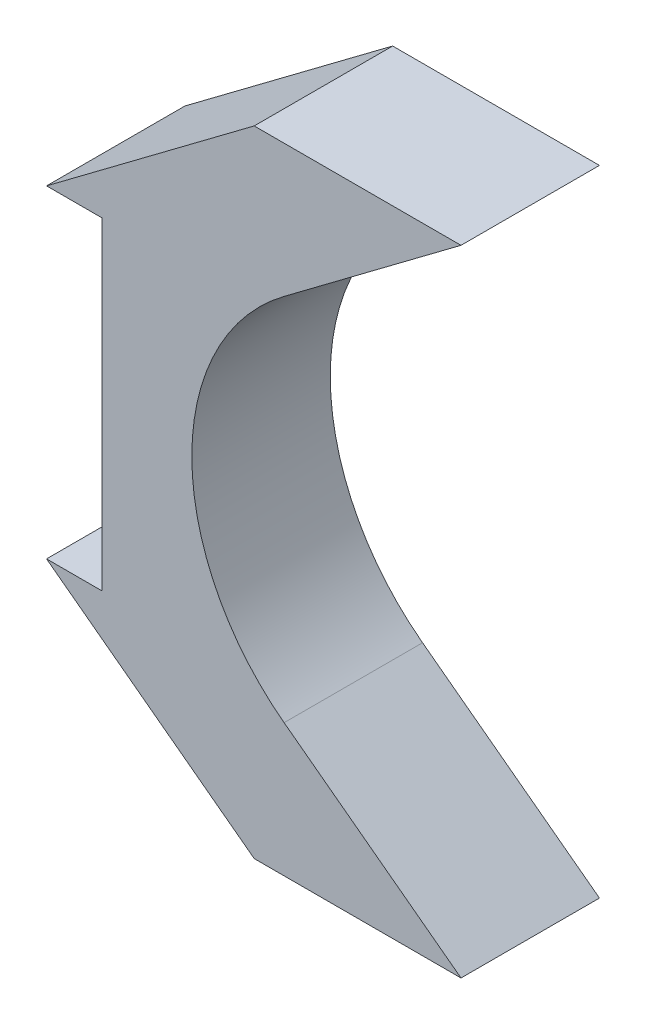
ISO-10303-21;
HEADER;
FILE_DESCRIPTION(('STEP AP214'),'2;1');
FILE_NAME('part.step','',(''),(''),'','','');
FILE_SCHEMA(('AUTOMOTIVE_DESIGN { 1 0 10303 214 1 1 1 1 }'));
ENDSEC;
DATA;
#1=APPLICATION_CONTEXT('core data for automotive mechanical design processes');
#2=APPLICATION_PROTOCOL_DEFINITION('international standard','automotive_design',2000,#1);
#3=PRODUCT_CONTEXT('',#1,'mechanical');
#4=PRODUCT('Part','Part','',(#3));
#5=PRODUCT_RELATED_PRODUCT_CATEGORY('part','',(#4));
#6=PRODUCT_DEFINITION_FORMATION('','',#4);
#7=PRODUCT_DEFINITION_CONTEXT('part definition',#1,'design');
#8=PRODUCT_DEFINITION('design','',#6,#7);
#9=PRODUCT_DEFINITION_SHAPE('','',#8);
#10=(LENGTH_UNIT() NAMED_UNIT(*) SI_UNIT(.MILLI.,.METRE.));
#11=(NAMED_UNIT(*) PLANE_ANGLE_UNIT() SI_UNIT($,.RADIAN.));
#12=(NAMED_UNIT(*) SI_UNIT($,.STERADIAN.) SOLID_ANGLE_UNIT());
#13=UNCERTAINTY_MEASURE_WITH_UNIT(LENGTH_MEASURE(1.E-05),#10,'distance_accuracy_value','');
#14=(GEOMETRIC_REPRESENTATION_CONTEXT(3) GLOBAL_UNCERTAINTY_ASSIGNED_CONTEXT((#13)) GLOBAL_UNIT_ASSIGNED_CONTEXT((#10,
#11,#12)) REPRESENTATION_CONTEXT('',''));
#15=CARTESIAN_POINT('',(0.,0.,0.));
#16=DIRECTION('',(0.,0.,1.));
#17=DIRECTION('',(1.,0.,0.));
#18=AXIS2_PLACEMENT_3D('',#15,#16,#17);
#19=CARTESIAN_POINT('',(16.0000000000196,85.,36.5));
#20=DIRECTION('',(-1.,0.,0.));
#21=DIRECTION('',(0.,-1.,0.));
#22=AXIS2_PLACEMENT_3D('',#19,#20,#21);
#23=CONICAL_SURFACE('',#22,1.24999999999093,1.02974425741328);
#24=CARTESIAN_POINT('',(16.7510757758007,85.0000000000364,36.5));
#25=VERTEX_POINT('',#24);
#26=VERTEX_LOOP('',#25);
#27=FACE_BOUND('',#26,.T.);
#28=CARTESIAN_POINT('',(15.9999999999997,85.,36.5));
#29=DIRECTION('',(1.,0.,0.));
#30=DIRECTION('',(0.,1.,0.));
#31=AXIS2_PLACEMENT_3D('',#28,#29,#30);
#32=CIRCLE('',#31,1.25);
#33=CARTESIAN_POINT('',(15.9999999999997,86.25,36.5));
#34=VERTEX_POINT('',#33);
#35=EDGE_CURVE('E232',#34,#34,#32,.F.);
#36=ORIENTED_EDGE('',*,*,#35,.T.);
#37=EDGE_LOOP('',(#36));
#38=FACE_BOUND('',#37,.T.);
#39=ADVANCED_FACE('F16',(#27,#38),#23,.F.);
#40=CARTESIAN_POINT('',(15.9999999999627,65.0000000000001,36.5));
#41=DIRECTION('',(-1.,0.,0.));
#42=DIRECTION('',(0.,-1.,0.));
#43=AXIS2_PLACEMENT_3D('',#40,#41,#42);
#44=CONICAL_SURFACE('',#43,1.25000000002956,1.02974425746065);
#45=CARTESIAN_POINT('',(16.7510757758009,65.0000000000546,36.4999999999999));
#46=VERTEX_POINT('',#45);
#47=VERTEX_LOOP('',#46);
#48=FACE_BOUND('',#47,.T.);
#49=CARTESIAN_POINT('',(15.9999999999998,65.0000000000001,36.5));
#50=DIRECTION('',(1.,0.,0.));
#51=DIRECTION('',(0.,1.,0.));
#52=AXIS2_PLACEMENT_3D('',#49,#50,#51);
#53=CIRCLE('',#52,1.25);
#54=CARTESIAN_POINT('',(15.9999999999998,66.2500000000001,36.5));
#55=VERTEX_POINT('',#54);
#56=EDGE_CURVE('E199',#55,#55,#53,.F.);
#57=ORIENTED_EDGE('',*,*,#56,.T.);
#58=EDGE_LOOP('',(#57));
#59=FACE_BOUND('',#58,.T.);
#60=ADVANCED_FACE('F334',(#48,#59),#44,.F.);
#61=CARTESIAN_POINT('',(9.99999999999956,85.0000000000001,36.4999999999999));
#62=DIRECTION('',(1.,0.,0.));
#63=DIRECTION('',(0.,1.,0.));
#64=AXIS2_PLACEMENT_3D('',#61,#62,#63);
#65=CYLINDRICAL_SURFACE('',#64,1.25);
#66=ORIENTED_EDGE('',*,*,#35,.F.);
#67=EDGE_LOOP('',(#66));
#68=FACE_BOUND('',#67,.T.);
#69=CARTESIAN_POINT('',(10.2500000002123,85.,36.5));
#70=DIRECTION('',(-1.,0.,0.));
#71=DIRECTION('',(0.,0.,1.));
#72=AXIS2_PLACEMENT_3D('',#69,#70,#71);
#73=CIRCLE('',#72,1.25000000030104);
#74=CARTESIAN_POINT('',(10.2500000002123,85.,37.750000000301));
#75=VERTEX_POINT('',#74);
#76=EDGE_CURVE('E194',#75,#75,#73,.T.);
#77=ORIENTED_EDGE('',*,*,#76,.T.);
#78=EDGE_LOOP('',(#77));
#79=FACE_BOUND('',#78,.T.);
#80=ADVANCED_FACE('F331',(#68,#79),#65,.F.);
#81=CARTESIAN_POINT('',(9.99999999999979,65.0000000000001,36.5));
#82=DIRECTION('',(1.,0.,0.));
#83=DIRECTION('',(0.,1.,0.));
#84=AXIS2_PLACEMENT_3D('',#81,#82,#83);
#85=CYLINDRICAL_SURFACE('',#84,1.25);
#86=ORIENTED_EDGE('',*,*,#56,.F.);
#87=EDGE_LOOP('',(#86));
#88=FACE_BOUND('',#87,.T.);
#89=CARTESIAN_POINT('',(10.2500000002693,65.0000000000001,36.5));
#90=DIRECTION('',(-1.,0.,0.));
#91=DIRECTION('',(0.,0.,1.));
#92=AXIS2_PLACEMENT_3D('',#89,#90,#91);
#93=CIRCLE('',#92,1.2500000002442);
#94=CARTESIAN_POINT('',(10.2500000002693,65.0000000000001,37.7500000002442));
#95=VERTEX_POINT('',#94);
#96=EDGE_CURVE('E142',#95,#95,#93,.T.);
#97=ORIENTED_EDGE('',*,*,#96,.T.);
#98=EDGE_LOOP('',(#97));
#99=FACE_BOUND('',#98,.T.);
#100=ADVANCED_FACE('F328',(#88,#99),#85,.F.);
#101=CARTESIAN_POINT('',(10.0000000000477,85.,36.4999999999999));
#102=DIRECTION('',(-1.,0.,0.));
#103=DIRECTION('',(0.,0.,1.));
#104=AXIS2_PLACEMENT_3D('',#101,#102,#103);
#105=CONICAL_SURFACE('',#104,1.49999999995407,0.785398162374267);
#106=CARTESIAN_POINT('',(9.99999999999068,85.,36.4999999999999));
#107=DIRECTION('',(-1.,0.,0.));
#108=DIRECTION('',(0.,0.,1.));
#109=AXIS2_PLACEMENT_3D('',#106,#107,#108);
#110=CIRCLE('',#109,1.50000000001092);
#111=CARTESIAN_POINT('',(9.99999999999068,85.,38.0000000000108));
#112=VERTEX_POINT('',#111);
#113=EDGE_CURVE('E183',#112,#112,#110,.T.);
#114=ORIENTED_EDGE('',*,*,#113,.T.);
#115=EDGE_LOOP('',(#114));
#116=FACE_BOUND('',#115,.T.);
#117=ORIENTED_EDGE('',*,*,#76,.F.);
#118=EDGE_LOOP('',(#117));
#119=FACE_BOUND('',#118,.T.);
#120=ADVANCED_FACE('F245',(#116,#119),#105,.F.);
#121=CARTESIAN_POINT('',(10.0000000000477,65.,36.5));
#122=DIRECTION('',(-1.,0.,0.));
#123=DIRECTION('',(0.,0.,1.));
#124=AXIS2_PLACEMENT_3D('',#121,#122,#123);
#125=CONICAL_SURFACE('',#124,1.50000000001092,0.785398162487954);
#126=CARTESIAN_POINT('',(10.0000000000477,65.,36.5));
#127=DIRECTION('',(-1.,0.,0.));
#128=DIRECTION('',(0.,0.,1.));
#129=AXIS2_PLACEMENT_3D('',#126,#127,#128);
#130=CIRCLE('',#129,1.50000000001092);
#131=CARTESIAN_POINT('',(10.0000000000477,65.,38.0000000000109));
#132=VERTEX_POINT('',#131);
#133=EDGE_CURVE('E178',#132,#132,#130,.T.);
#134=ORIENTED_EDGE('',*,*,#133,.T.);
#135=EDGE_LOOP('',(#134));
#136=FACE_BOUND('',#135,.T.);
#137=ORIENTED_EDGE('',*,*,#96,.F.);
#138=EDGE_LOOP('',(#137));
#139=FACE_BOUND('',#138,.T.);
#140=ADVANCED_FACE('F322',(#136,#139),#125,.F.);
#141=CARTESIAN_POINT('',(9.99999999999956,67.5000000000003,29.));
#142=DIRECTION('',(0.,0.,1.));
#143=DIRECTION('',(1.,0.,0.));
#144=AXIS2_PLACEMENT_3D('',#141,#142,#143);
#145=PLANE('',#144);
#146=DIRECTION('',(1.,0.,0.));
#147=VECTOR('',#146,1.);
#148=CARTESIAN_POINT('',(55.0000000000003,40.6250000000005,29.));
#149=LINE('',#148,#147);
#150=CARTESIAN_POINT('',(48.907206184868,40.6250000000005,29.));
#151=VERTEX_POINT('',#150);
#152=CARTESIAN_POINT('',(26.4999999999999,40.6250000000005,29.));
#153=VERTEX_POINT('',#152);
#154=EDGE_CURVE('E111',#151,#153,#149,.F.);
#155=ORIENTED_EDGE('',*,*,#154,.T.);
#156=DIRECTION('',(0.800000000000003,-0.599999999999996,0.));
#157=VECTOR('',#156,1.);
#158=CARTESIAN_POINT('',(3.99999999999967,57.5000000000004,29.));
#159=LINE('',#158,#157);
#160=CARTESIAN_POINT('',(3.99999999999967,57.5000000000004,29.));
#161=VERTEX_POINT('',#160);
#162=EDGE_CURVE('E136',#161,#153,#159,.T.);
#163=ORIENTED_EDGE('',*,*,#162,.F.);
#164=DIRECTION('',(1.,0.,0.));
#165=VECTOR('',#164,1.);
#166=CARTESIAN_POINT('',(9.99999999999979,57.5000000000005,29.));
#167=LINE('',#166,#165);
#168=CARTESIAN_POINT('',(9.99999999999979,57.5000000000005,29.));
#169=VERTEX_POINT('',#168);
#170=EDGE_CURVE('E150',#169,#161,#167,.F.);
#171=ORIENTED_EDGE('',*,*,#170,.F.);
#172=DIRECTION('',(0.,1.,0.));
#173=VECTOR('',#172,1.);
#174=CARTESIAN_POINT('',(9.99999999999968,82.5000000000001,29.));
#175=LINE('',#174,#173);
#176=CARTESIAN_POINT('',(9.9999999999999,92.5,29.));
#177=VERTEX_POINT('',#176);
#178=EDGE_CURVE('E164',#169,#177,#175,.T.);
#179=ORIENTED_EDGE('',*,*,#178,.T.);
#180=DIRECTION('',(1.,0.,0.));
#181=VECTOR('',#180,1.);
#182=CARTESIAN_POINT('',(3.99999999999989,92.5000000000001,29.0000000000001));
#183=LINE('',#182,#181);
#184=CARTESIAN_POINT('',(3.99999999999978,92.5000000000001,29.0000000000001));
#185=VERTEX_POINT('',#184);
#186=EDGE_CURVE('E181',#185,#177,#183,.T.);
#187=ORIENTED_EDGE('',*,*,#186,.F.);
#188=DIRECTION('',(-0.800000000000001,-0.599999999999999,0.));
#189=VECTOR('',#188,1.);
#190=CARTESIAN_POINT('',(26.4999999999997,109.375,29.));
#191=LINE('',#190,#189);
#192=CARTESIAN_POINT('',(26.4999999999997,109.375,29.));
#193=VERTEX_POINT('',#192);
#194=EDGE_CURVE('E204',#193,#185,#191,.T.);
#195=ORIENTED_EDGE('',*,*,#194,.F.);
#196=DIRECTION('',(1.,0.,0.));
#197=VECTOR('',#196,1.);
#198=CARTESIAN_POINT('',(32.4999999999998,109.375,29.));
#199=LINE('',#198,#197);
#200=CARTESIAN_POINT('',(48.9072061848684,109.375,29.));
#201=VERTEX_POINT('',#200);
#202=EDGE_CURVE('E218',#193,#201,#199,.T.);
#203=ORIENTED_EDGE('',*,*,#202,.T.);
#204=DIRECTION('',(-0.800000000000001,-0.599999999999999,0.));
#205=VECTOR('',#204,1.);
#206=CARTESIAN_POINT('',(33.7405395182018,98.0000000000002,29.));
#207=LINE('',#206,#205);
#208=CARTESIAN_POINT('',(29.740539518202,95.0000000000003,29.));
#209=VERTEX_POINT('',#208);
#210=EDGE_CURVE('E102',#201,#209,#207,.T.);
#211=ORIENTED_EDGE('',*,*,#210,.T.);
#212=CARTESIAN_POINT('',(44.7405395182019,75.0000000000002,28.9999999999999));
#213=DIRECTION('',(0.,0.,-1.));
#214=DIRECTION('',(-1.,0.,0.));
#215=AXIS2_PLACEMENT_3D('',#212,#213,#214);
#216=CIRCLE('',#215,25.);
#217=CARTESIAN_POINT('',(29.7405395182019,55.0000000000003,29.));
#218=VERTEX_POINT('',#217);
#219=EDGE_CURVE('E19',#209,#218,#216,.F.);
#220=ORIENTED_EDGE('',*,*,#219,.T.);
#221=DIRECTION('',(0.799999999999997,-0.600000000000004,0.));
#222=VECTOR('',#221,1.);
#223=CARTESIAN_POINT('',(99.9999999999999,2.30540463865103,29.));
#224=LINE('',#223,#222);
#225=EDGE_CURVE('E99',#218,#151,#224,.T.);
#226=ORIENTED_EDGE('',*,*,#225,.T.);
#227=EDGE_LOOP('',(#155,#163,#171,#179,#187,#195,#203,#211,#220,#226));
#228=FACE_BOUND('',#227,.T.);
#229=ADVANCED_FACE('F98',(#228),#145,.F.);
#230=CARTESIAN_POINT('',(54.9999999999999,40.6250000000005,23.0999999999998));
#231=DIRECTION('',(0.,1.,0.));
#232=DIRECTION('',(0.,0.,1.));
#233=AXIS2_PLACEMENT_3D('',#230,#231,#232);
#234=PLANE('',#233);
#235=DIRECTION('',(0.,0.,1.));
#236=VECTOR('',#235,1.);
#237=CARTESIAN_POINT('',(26.4999999999999,40.6250000000004,25.));
#238=LINE('',#237,#236);
#239=CARTESIAN_POINT('',(26.5,40.6250000000004,43.9999999999999));
#240=VERTEX_POINT('',#239);
#241=EDGE_CURVE('E131',#153,#240,#238,.T.);
#242=ORIENTED_EDGE('',*,*,#241,.F.);
#243=ORIENTED_EDGE('',*,*,#154,.F.);
#244=DIRECTION('',(0.,0.,1.));
#245=VECTOR('',#244,1.);
#246=CARTESIAN_POINT('',(48.9072061848679,40.6250000000005,49.9999999999999));
#247=LINE('',#246,#245);
#248=CARTESIAN_POINT('',(48.9072061848681,40.6250000000004,44.));
#249=VERTEX_POINT('',#248);
#250=EDGE_CURVE('E105',#151,#249,#247,.T.);
#251=ORIENTED_EDGE('',*,*,#250,.T.);
#252=DIRECTION('',(1.,0.,0.));
#253=VECTOR('',#252,1.);
#254=CARTESIAN_POINT('',(9.99999999999968,40.6250000000004,44.));
#255=LINE('',#254,#253);
#256=EDGE_CURVE('E127',#240,#249,#255,.T.);
#257=ORIENTED_EDGE('',*,*,#256,.F.);
#258=EDGE_LOOP('',(#242,#243,#251,#257));
#259=FACE_BOUND('',#258,.T.);
#260=ADVANCED_FACE('F282',(#259),#234,.F.);
#261=CARTESIAN_POINT('',(100.,2.30540463865103,50.));
#262=DIRECTION('',(-0.600000000000004,-0.799999999999997,0.));
#263=DIRECTION('',(0.799999999999997,-0.600000000000004,0.));
#264=AXIS2_PLACEMENT_3D('',#261,#262,#263);
#265=PLANE('',#264);
#266=ORIENTED_EDGE('',*,*,#250,.F.);
#267=ORIENTED_EDGE('',*,*,#225,.F.);
#268=DIRECTION('',(0.,0.,-1.));
#269=VECTOR('',#268,1.);
#270=CARTESIAN_POINT('',(29.7405395182019,55.0000000000003,49.9999999999999));
#271=LINE('',#270,#269);
#272=CARTESIAN_POINT('',(29.7405395182017,55.0000000000003,43.9999999999999));
#273=VERTEX_POINT('',#272);
#274=EDGE_CURVE('E104',#218,#273,#271,.F.);
#275=ORIENTED_EDGE('',*,*,#274,.T.);
#276=DIRECTION('',(-0.799999999999999,0.600000000000002,0.));
#277=VECTOR('',#276,1.);
#278=CARTESIAN_POINT('',(48.9072061848681,40.6250000000005,44.));
#279=LINE('',#278,#277);
#280=EDGE_CURVE('E130',#249,#273,#279,.T.);
#281=ORIENTED_EDGE('',*,*,#280,.F.);
#282=EDGE_LOOP('',(#266,#267,#275,#281));
#283=FACE_BOUND('',#282,.T.);
#284=ADVANCED_FACE('F108',(#283),#265,.F.);
#285=CARTESIAN_POINT('',(44.7405395182019,75.0000000000002,50.));
#286=DIRECTION('',(0.,0.,-1.));
#287=DIRECTION('',(-1.,0.,0.));
#288=AXIS2_PLACEMENT_3D('',#285,#286,#287);
#289=CYLINDRICAL_SURFACE('',#288,25.);
#290=ORIENTED_EDGE('',*,*,#274,.F.);
#291=ORIENTED_EDGE('',*,*,#219,.F.);
#292=DIRECTION('',(0.,0.,1.));
#293=VECTOR('',#292,1.);
#294=CARTESIAN_POINT('',(29.740539518202,95.0000000000003,49.9999999999999));
#295=LINE('',#294,#293);
#296=CARTESIAN_POINT('',(29.7405395182018,95.0000000000004,43.9999999999999));
#297=VERTEX_POINT('',#296);
#298=EDGE_CURVE('E117',#209,#297,#295,.T.);
#299=ORIENTED_EDGE('',*,*,#298,.T.);
#300=CARTESIAN_POINT('',(44.7405395182019,75.0000000000002,43.9999999999999));
#301=DIRECTION('',(0.,0.,-1.));
#302=DIRECTION('',(-1.,0.,0.));
#303=AXIS2_PLACEMENT_3D('',#300,#301,#302);
#304=CIRCLE('',#303,25.);
#305=EDGE_CURVE('E115',#273,#297,#304,.T.);
#306=ORIENTED_EDGE('',*,*,#305,.F.);
#307=EDGE_LOOP('',(#290,#291,#299,#306));
#308=FACE_BOUND('',#307,.T.);
#309=ADVANCED_FACE('F113',(#308),#289,.F.);
#310=CARTESIAN_POINT('',(33.7405395182019,98.0000000000003,50.));
#311=DIRECTION('',(-0.599999999999999,0.800000000000001,0.));
#312=DIRECTION('',(-0.800000000000001,-0.599999999999999,0.));
#313=AXIS2_PLACEMENT_3D('',#310,#311,#312);
#314=PLANE('',#313);
#315=DIRECTION('',(0.,0.,-1.));
#316=VECTOR('',#315,1.);
#317=CARTESIAN_POINT('',(48.9072061848683,109.375,23.1));
#318=LINE('',#317,#316);
#319=CARTESIAN_POINT('',(48.9072061848684,109.375,43.9999999999999));
#320=VERTEX_POINT('',#319);
#321=EDGE_CURVE('E222',#201,#320,#318,.F.);
#322=ORIENTED_EDGE('',*,*,#321,.T.);
#323=DIRECTION('',(0.800000000000004,0.599999999999995,0.));
#324=VECTOR('',#323,1.);
#325=CARTESIAN_POINT('',(29.7405395182018,95.0000000000004,43.9999999999999));
#326=LINE('',#325,#324);
#327=EDGE_CURVE('E240',#297,#320,#326,.T.);
#328=ORIENTED_EDGE('',*,*,#327,.F.);
#329=ORIENTED_EDGE('',*,*,#298,.F.);
#330=ORIENTED_EDGE('',*,*,#210,.F.);
#331=EDGE_LOOP('',(#322,#328,#329,#330));
#332=FACE_BOUND('',#331,.T.);
#333=ADVANCED_FACE('F298',(#332),#314,.F.);
#334=CARTESIAN_POINT('',(32.4999999999996,109.375,23.1000000000001));
#335=DIRECTION('',(0.,-1.,0.));
#336=DIRECTION('',(0.,0.,-1.));
#337=AXIS2_PLACEMENT_3D('',#334,#335,#336);
#338=PLANE('',#337);
#339=DIRECTION('',(0.,0.,1.));
#340=VECTOR('',#339,1.);
#341=CARTESIAN_POINT('',(26.4999999999999,109.375,25.));
#342=LINE('',#341,#340);
#343=CARTESIAN_POINT('',(26.4999999999999,109.375,44.));
#344=VERTEX_POINT('',#343);
#345=EDGE_CURVE('E208',#344,#193,#342,.F.);
#346=ORIENTED_EDGE('',*,*,#345,.F.);
#347=DIRECTION('',(1.,0.,0.));
#348=VECTOR('',#347,1.);
#349=CARTESIAN_POINT('',(9.99999999999979,109.375,44.));
#350=LINE('',#349,#348);
#351=EDGE_CURVE('E213',#320,#344,#350,.F.);
#352=ORIENTED_EDGE('',*,*,#351,.F.);
#353=ORIENTED_EDGE('',*,*,#321,.F.);
#354=ORIENTED_EDGE('',*,*,#202,.F.);
#355=EDGE_LOOP('',(#346,#352,#353,#354));
#356=FACE_BOUND('',#355,.T.);
#357=ADVANCED_FACE('F300',(#356),#338,.F.);
#358=CARTESIAN_POINT('',(26.4999999999999,109.375,25.));
#359=DIRECTION('',(-0.599999999999999,0.800000000000001,0.));
#360=DIRECTION('',(-0.800000000000001,-0.599999999999999,0.));
#361=AXIS2_PLACEMENT_3D('',#358,#359,#360);
#362=PLANE('',#361);
#363=ORIENTED_EDGE('',*,*,#194,.T.);
#364=DIRECTION('',(0.,0.,1.));
#365=VECTOR('',#364,1.);
#366=CARTESIAN_POINT('',(3.99999999999967,92.5000000000001,25.));
#367=LINE('',#366,#365);
#368=CARTESIAN_POINT('',(3.99999999999956,92.5,44.));
#369=VERTEX_POINT('',#368);
#370=EDGE_CURVE('E184',#369,#185,#367,.F.);
#371=ORIENTED_EDGE('',*,*,#370,.F.);
#372=DIRECTION('',(-0.8,-0.6,0.));
#373=VECTOR('',#372,1.);
#374=CARTESIAN_POINT('',(26.4999999999999,109.375,44.));
#375=LINE('',#374,#373);
#376=EDGE_CURVE('E189',#344,#369,#375,.T.);
#377=ORIENTED_EDGE('',*,*,#376,.F.);
#378=ORIENTED_EDGE('',*,*,#345,.T.);
#379=EDGE_LOOP('',(#363,#371,#377,#378));
#380=FACE_BOUND('',#379,.T.);
#381=ADVANCED_FACE('F261',(#380),#362,.T.);
#382=CARTESIAN_POINT('',(3.99999999999967,92.5000000000001,25.));
#383=DIRECTION('',(0.,-1.,0.));
#384=DIRECTION('',(1.,0.,0.));
#385=AXIS2_PLACEMENT_3D('',#382,#383,#384);
#386=PLANE('',#385);
#387=ORIENTED_EDGE('',*,*,#186,.T.);
#388=DIRECTION('',(0.,0.,1.));
#389=VECTOR('',#388,1.);
#390=CARTESIAN_POINT('',(9.9999999999999,92.5,50.));
#391=LINE('',#390,#389);
#392=CARTESIAN_POINT('',(9.99999999999968,92.5000000000001,44.));
#393=VERTEX_POINT('',#392);
#394=EDGE_CURVE('E169',#177,#393,#391,.T.);
#395=ORIENTED_EDGE('',*,*,#394,.T.);
#396=DIRECTION('',(1.,0.,0.));
#397=VECTOR('',#396,1.);
#398=CARTESIAN_POINT('',(9.99999999999956,92.5000000000001,44.));
#399=LINE('',#398,#397);
#400=EDGE_CURVE('E174',#369,#393,#399,.T.);
#401=ORIENTED_EDGE('',*,*,#400,.F.);
#402=ORIENTED_EDGE('',*,*,#370,.T.);
#403=EDGE_LOOP('',(#387,#395,#401,#402));
#404=FACE_BOUND('',#403,.T.);
#405=ADVANCED_FACE('F251',(#404),#386,.T.);
#406=CARTESIAN_POINT('',(9.9999999999999,82.5,50.));
#407=DIRECTION('',(1.,0.,0.));
#408=DIRECTION('',(0.,1.,0.));
#409=AXIS2_PLACEMENT_3D('',#406,#407,#408);
#410=PLANE('',#409);
#411=DIRECTION('',(0.,0.,1.));
#412=VECTOR('',#411,1.);
#413=CARTESIAN_POINT('',(9.99999999999968,57.5000000000005,25.));
#414=LINE('',#413,#412);
#415=CARTESIAN_POINT('',(9.99999999999968,57.5000000000004,43.9999999999999));
#416=VERTEX_POINT('',#415);
#417=EDGE_CURVE('E154',#416,#169,#414,.F.);
#418=ORIENTED_EDGE('',*,*,#417,.F.);
#419=DIRECTION('',(0.,1.,0.));
#420=VECTOR('',#419,1.);
#421=CARTESIAN_POINT('',(9.99999999999979,67.5000000000005,44.));
#422=LINE('',#421,#420);
#423=EDGE_CURVE('E159',#393,#416,#422,.F.);
#424=ORIENTED_EDGE('',*,*,#423,.F.);
#425=ORIENTED_EDGE('',*,*,#394,.F.);
#426=ORIENTED_EDGE('',*,*,#178,.F.);
#427=EDGE_LOOP('',(#418,#424,#425,#426));
#428=FACE_BOUND('',#427,.T.);
#429=ORIENTED_EDGE('',*,*,#133,.F.);
#430=EDGE_LOOP('',(#429));
#431=FACE_BOUND('',#430,.T.);
#432=ORIENTED_EDGE('',*,*,#113,.F.);
#433=EDGE_LOOP('',(#432));
#434=FACE_BOUND('',#433,.T.);
#435=ADVANCED_FACE('F248',(#428,#431,#434),#410,.F.);
#436=CARTESIAN_POINT('',(9.99999999999968,57.5000000000005,25.));
#437=DIRECTION('',(0.,1.,0.));
#438=DIRECTION('',(0.,0.,1.));
#439=AXIS2_PLACEMENT_3D('',#436,#437,#438);
#440=PLANE('',#439);
#441=ORIENTED_EDGE('',*,*,#170,.T.);
#442=DIRECTION('',(0.,0.,1.));
#443=VECTOR('',#442,1.);
#444=CARTESIAN_POINT('',(3.99999999999956,57.5000000000004,25.));
#445=LINE('',#444,#443);
#446=CARTESIAN_POINT('',(3.99999999999967,57.5000000000005,44.));
#447=VERTEX_POINT('',#446);
#448=EDGE_CURVE('E34',#447,#161,#445,.F.);
#449=ORIENTED_EDGE('',*,*,#448,.F.);
#450=DIRECTION('',(1.,0.,0.));
#451=VECTOR('',#450,1.);
#452=CARTESIAN_POINT('',(9.99999999999968,57.5000000000004,43.9999999999999));
#453=LINE('',#452,#451);
#454=EDGE_CURVE('E25',#416,#447,#453,.F.);
#455=ORIENTED_EDGE('',*,*,#454,.F.);
#456=ORIENTED_EDGE('',*,*,#417,.T.);
#457=EDGE_LOOP('',(#441,#449,#455,#456));
#458=FACE_BOUND('',#457,.T.);
#459=ADVANCED_FACE('F250',(#458),#440,.T.);
#460=CARTESIAN_POINT('',(3.99999999999956,57.5000000000004,25.));
#461=DIRECTION('',(-0.599999999999996,-0.800000000000003,0.));
#462=DIRECTION('',(0.800000000000003,-0.599999999999996,0.));
#463=AXIS2_PLACEMENT_3D('',#460,#461,#462);
#464=PLANE('',#463);
#465=ORIENTED_EDGE('',*,*,#162,.T.);
#466=ORIENTED_EDGE('',*,*,#241,.T.);
#467=DIRECTION('',(0.800000000000003,-0.599999999999996,0.));
#468=VECTOR('',#467,1.);
#469=CARTESIAN_POINT('',(3.99999999999967,57.5000000000005,44.));
#470=LINE('',#469,#468);
#471=EDGE_CURVE('E11',#447,#240,#470,.T.);
#472=ORIENTED_EDGE('',*,*,#471,.F.);
#473=ORIENTED_EDGE('',*,*,#448,.T.);
#474=EDGE_LOOP('',(#465,#466,#472,#473));
#475=FACE_BOUND('',#474,.T.);
#476=ADVANCED_FACE('F259',(#475),#464,.T.);
#477=CARTESIAN_POINT('',(9.99999999999968,67.5000000000005,44.));
#478=DIRECTION('',(0.,0.,1.));
#479=DIRECTION('',(1.,0.,0.));
#480=AXIS2_PLACEMENT_3D('',#477,#478,#479);
#481=PLANE('',#480);
#482=ORIENTED_EDGE('',*,*,#454,.T.);
#483=ORIENTED_EDGE('',*,*,#471,.T.);
#484=ORIENTED_EDGE('',*,*,#256,.T.);
#485=ORIENTED_EDGE('',*,*,#280,.T.);
#486=ORIENTED_EDGE('',*,*,#305,.T.);
#487=ORIENTED_EDGE('',*,*,#327,.T.);
#488=ORIENTED_EDGE('',*,*,#351,.T.);
#489=ORIENTED_EDGE('',*,*,#376,.T.);
#490=ORIENTED_EDGE('',*,*,#400,.T.);
#491=ORIENTED_EDGE('',*,*,#423,.T.);
#492=EDGE_LOOP('',(#482,#483,#484,#485,#486,#487,#488,#489,#490,#491));
#493=FACE_BOUND('',#492,.T.);
#494=ADVANCED_FACE('F265',(#493),#481,.T.);
#495=CLOSED_SHELL('',(#39,#60,#80,#100,#120,#140,#229,#260,#284,#309,#333,#357,#381,#405,#435,
#459,#476,#494));
#496=MANIFOLD_SOLID_BREP('B1',#495);
#497=ADVANCED_BREP_SHAPE_REPRESENTATION('',(#18,#496),#14);
#498=SHAPE_DEFINITION_REPRESENTATION(#9,#497);
ENDSEC;
END-ISO-10303-21;
